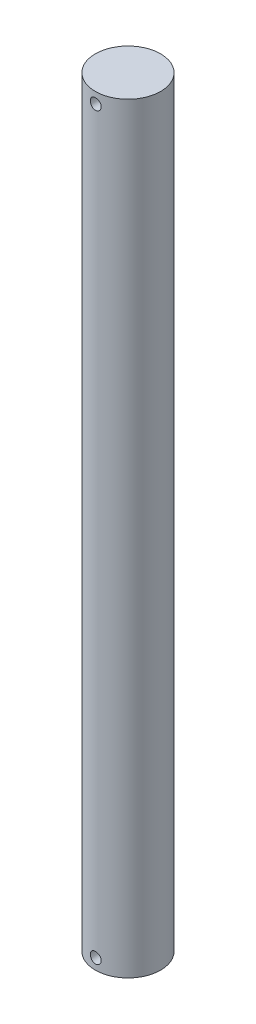
ISO-10303-21;
HEADER;
FILE_DESCRIPTION(('STEP AP214'),'2;1');
FILE_NAME('part.step','',(''),(''),'','','');
FILE_SCHEMA(('AUTOMOTIVE_DESIGN { 1 0 10303 214 1 1 1 1 }'));
ENDSEC;
DATA;
#1=APPLICATION_CONTEXT('core data for automotive mechanical design processes');
#2=APPLICATION_PROTOCOL_DEFINITION('international standard','automotive_design',2000,#1);
#3=PRODUCT_CONTEXT('',#1,'mechanical');
#4=PRODUCT('Part','Part','',(#3));
#5=PRODUCT_RELATED_PRODUCT_CATEGORY('part','',(#4));
#6=PRODUCT_DEFINITION_FORMATION('','',#4);
#7=PRODUCT_DEFINITION_CONTEXT('part definition',#1,'design');
#8=PRODUCT_DEFINITION('design','',#6,#7);
#9=PRODUCT_DEFINITION_SHAPE('','',#8);
#10=(LENGTH_UNIT() NAMED_UNIT(*) SI_UNIT(.MILLI.,.METRE.));
#11=(NAMED_UNIT(*) PLANE_ANGLE_UNIT() SI_UNIT($,.RADIAN.));
#12=(NAMED_UNIT(*) SI_UNIT($,.STERADIAN.) SOLID_ANGLE_UNIT());
#13=UNCERTAINTY_MEASURE_WITH_UNIT(LENGTH_MEASURE(1.E-05),#10,'distance_accuracy_value','');
#14=(GEOMETRIC_REPRESENTATION_CONTEXT(3) GLOBAL_UNCERTAINTY_ASSIGNED_CONTEXT((#13)) GLOBAL_UNIT_ASSIGNED_CONTEXT((#10,
#11,#12)) REPRESENTATION_CONTEXT('',''));
#15=CARTESIAN_POINT('',(0.,0.,0.));
#16=DIRECTION('',(0.,0.,1.));
#17=DIRECTION('',(1.,0.,0.));
#18=AXIS2_PLACEMENT_3D('',#15,#16,#17);
#19=CARTESIAN_POINT('',(0.,700.,0.));
#20=DIRECTION('',(0.,-1.,0.));
#21=DIRECTION('',(0.,0.,-1.));
#22=AXIS2_PLACEMENT_3D('',#19,#20,#21);
#23=CYLINDRICAL_SURFACE('',#22,30.);
#24=CARTESIAN_POINT('',(0.,15.,-30.));
#25=CARTESIAN_POINT('',(-0.139438730306518,15.000002148603,-30.0000009341092));
#26=CARTESIAN_POINT('',(-0.27884837499536,14.9941652443515,-29.9990260400444));
#27=CARTESIAN_POINT('',(-0.556708896140972,14.9708658164974,-29.9951557115238));
#28=CARTESIAN_POINT('',(-0.695159577308831,14.9534009913958,-29.9922598968632));
#29=CARTESIAN_POINT('',(-0.970150520344154,14.9069611871019,-29.9846251699259));
#30=CARTESIAN_POINT('',(-1.10668952072418,14.8779789470685,-29.979885095025));
#31=CARTESIAN_POINT('',(-1.37685247096437,14.8087139445941,-29.9686930297133));
#32=CARTESIAN_POINT('',(-1.51047533178691,14.7684270356836,-29.9622404112013));
#33=CARTESIAN_POINT('',(-1.77365528085701,14.6769149986391,-29.9478128865368));
#34=CARTESIAN_POINT('',(-1.90321704710935,14.6257030293222,-29.9398398129292));
#35=CARTESIAN_POINT('',(-2.15759207174616,14.512668231626,-29.9225843720656));
#36=CARTESIAN_POINT('',(-2.28240355940393,14.4508414928787,-29.9133015225275));
#37=CARTESIAN_POINT('',(-2.52631223217171,14.3170688876175,-29.8936901460056));
#38=CARTESIAN_POINT('',(-2.64541222152925,14.2451280566014,-29.8833621400859));
#39=CARTESIAN_POINT('',(-2.87720075943645,14.0915826775771,-29.8619368035706));
#40=CARTESIAN_POINT('',(-2.98988690101178,14.0099745365835,-29.8508391875783));
#41=CARTESIAN_POINT('',(-3.20893550320275,13.8369740483396,-29.8280901061561));
#42=CARTESIAN_POINT('',(-3.3152386019937,13.7455070296461,-29.8164348485225));
#43=CARTESIAN_POINT('',(-3.51981905081325,13.5539441062719,-29.792977049997));
#44=CARTESIAN_POINT('',(-3.6180934149484,13.4538450195095,-29.7811744561748));
#45=CARTESIAN_POINT('',(-3.80586900468401,13.2457655657288,-29.757760553176));
#46=CARTESIAN_POINT('',(-3.89537288715651,13.137787602886,-29.7461491869625));
#47=CARTESIAN_POINT('',(-4.06505128766863,12.9146207574097,-29.7234367117224));
#48=CARTESIAN_POINT('',(-4.14522235269035,12.7994292299429,-29.7123357924676));
#49=CARTESIAN_POINT('',(-4.29606801839333,12.5619714746938,-29.6909016370194));
#50=CARTESIAN_POINT('',(-4.36668480543058,12.4396680682227,-29.6805732300208));
#51=CARTESIAN_POINT('',(-4.49737903615683,12.1894109133508,-29.6610510502017));
#52=CARTESIAN_POINT('',(-4.55745254274493,12.0614550764348,-29.6518577016161));
#53=CARTESIAN_POINT('',(-4.66655756396113,11.800880688985,-29.6348831234285));
#54=CARTESIAN_POINT('',(-4.7155937427807,11.6682641354876,-29.6271012976113));
#55=CARTESIAN_POINT('',(-4.80229722760728,11.399267690265,-29.6131700678879));
#56=CARTESIAN_POINT('',(-4.83996038282925,11.2628864443209,-29.6070212600786));
#57=CARTESIAN_POINT('',(-4.93477467758659,10.8521985241443,-29.5914227981395));
#58=CARTESIAN_POINT('',(-4.97488357358493,10.5736311346302,-29.5846386003063));
#59=CARTESIAN_POINT('',(-5.00784793424048,10.0137968416156,-29.5790755483693));
#60=CARTESIAN_POINT('',(-5.00070674304215,9.73253013056755,-29.5802961277241));
#61=CARTESIAN_POINT('',(-4.93978637434362,9.17815552142718,-29.590529429811));
#62=CARTESIAN_POINT('',(-4.88648873937526,8.90499340626046,-29.5994616948564));
#63=CARTESIAN_POINT('',(-4.73550730524632,8.37155435088744,-29.6239896757343));
#64=CARTESIAN_POINT('',(-4.63782198375658,8.11127785294845,-29.6395856201047));
#65=CARTESIAN_POINT('',(-4.40035421574883,7.60954316628105,-29.6757696483376));
#66=CARTESIAN_POINT('',(-4.26037175365461,7.36818140582108,-29.6963813586744));
#67=CARTESIAN_POINT('',(-3.94242410922568,6.91219098092208,-29.7402583517709));
#68=CARTESIAN_POINT('',(-3.76445586128014,6.69756447634457,-29.7635238486315));
#69=CARTESIAN_POINT('',(-3.37296440409906,6.29834788785884,-29.8104405621052));
#70=CARTESIAN_POINT('',(-3.15902792232791,6.1141629788504,-29.8340929858411));
#71=CARTESIAN_POINT('',(-2.70307050338167,5.78424445873864,-29.8788520267263));
#72=CARTESIAN_POINT('',(-2.46104938526711,5.63851109538495,-29.8999586274719));
#73=CARTESIAN_POINT('',(-1.95541183087794,5.38959554997958,-29.9372778581815));
#74=CARTESIAN_POINT('',(-1.6917774507324,5.2864491623958,-29.9534863682324));
#75=CARTESIAN_POINT('',(-1.15059669160235,5.1260115684498,-29.9791500601698));
#76=CARTESIAN_POINT('',(-0.873051478491172,5.06871652607123,-29.988605806999));
#77=CARTESIAN_POINT('',(-0.315419802472563,5.00215728305926,-29.999622596864));
#78=CARTESIAN_POINT('',(-0.0354014741699759,4.99233685528185,-30.0012750602153));
#79=CARTESIAN_POINT('',(0.522279545647737,5.01952268996312,-29.9967494884638));
#80=CARTESIAN_POINT('',(0.799942327386603,5.05652715067645,-29.9905717546544));
#81=CARTESIAN_POINT('',(1.3433123514886,5.17584969428862,-29.971136538593));
#82=CARTESIAN_POINT('',(1.60908173821583,5.25789240039748,-29.9579220953842));
#83=CARTESIAN_POINT('',(2.12309376827574,5.46466905278275,-29.9258892897492));
#84=CARTESIAN_POINT('',(2.37133542643381,5.5894053964243,-29.9070706126377));
#85=CARTESIAN_POINT('',(2.84566138437114,5.87930218769945,-29.8656903236297));
#86=CARTESIAN_POINT('',(3.07153052223238,6.04481008114228,-29.8430971086773));
#87=CARTESIAN_POINT('',(3.49248715064582,6.41107486197913,-29.7967693569018));
#88=CARTESIAN_POINT('',(3.68757240338597,6.61183430971993,-29.7730347372687));
#89=CARTESIAN_POINT('',(4.04348563611056,7.04539422403469,-29.7268034705286));
#90=CARTESIAN_POINT('',(4.20393781021313,7.27850506055188,-29.7043221945332));
#91=CARTESIAN_POINT('',(4.48340433261341,7.76870920865032,-29.6634307237625));
#92=CARTESIAN_POINT('',(4.60241999444133,8.02580175968778,-29.6450203999454));
#93=CARTESIAN_POINT('',(4.79507773356379,8.55556730727753,-29.6144685973239));
#94=CARTESIAN_POINT('',(4.86890685306042,8.82817090119132,-29.602301310812));
#95=CARTESIAN_POINT('',(4.96966691993878,9.38228554337532,-29.5855561119601));
#96=CARTESIAN_POINT('',(4.99660194454599,9.66379581508378,-29.580977539818));
#97=CARTESIAN_POINT('',(5.0012321244509,10.0844097834175,-29.5801885462874));
#98=CARTESIAN_POINT('',(4.99693975789018,10.2235369220243,-29.5809172344068));
#99=CARTESIAN_POINT('',(4.97678436801742,10.5009125844857,-29.5843160283654));
#100=CARTESIAN_POINT('',(4.96092569221815,10.6391614187853,-29.5869854047428));
#101=CARTESIAN_POINT('',(4.91774640529922,10.9138477892768,-29.5941926651669));
#102=CARTESIAN_POINT('',(4.89042170080803,11.0502846606349,-29.5987312164982));
#103=CARTESIAN_POINT('',(4.82453301754958,11.3202964548754,-29.6095423170401));
#104=CARTESIAN_POINT('',(4.78597308458851,11.4538723894262,-29.615814242021));
#105=CARTESIAN_POINT('',(4.6979342864003,11.7171686051217,-29.6299071307843));
#106=CARTESIAN_POINT('',(4.64846435664851,11.846891943521,-29.6377268263817));
#107=CARTESIAN_POINT('',(4.53896986674982,12.1016587264378,-29.6546930297384));
#108=CARTESIAN_POINT('',(4.47894908739059,12.226703827951,-29.6638390620139));
#109=CARTESIAN_POINT('',(4.34874498523013,12.4713614507995,-29.6832065043881));
#110=CARTESIAN_POINT('',(4.27855767862003,12.5909718182554,-29.6934283356131));
#111=CARTESIAN_POINT('',(4.12855715704193,12.8238615256318,-29.7146554589665));
#112=CARTESIAN_POINT('',(4.04874732556529,12.9371430705211,-29.7256604751555));
#113=CARTESIAN_POINT('',(3.87899685367998,13.1580086987021,-29.7482907408856));
#114=CARTESIAN_POINT('',(3.78894418512202,13.2655060901041,-29.7599219326499));
#115=CARTESIAN_POINT('',(3.60017574898997,13.472513396479,-29.783347263822));
#116=CARTESIAN_POINT('',(3.50146308651917,13.5720261500963,-29.7951413435574));
#117=CARTESIAN_POINT('',(3.29596225179814,13.7624819299774,-29.8185735949796));
#118=CARTESIAN_POINT('',(3.18916929766622,13.8534198090311,-29.8302116694714));
#119=CARTESIAN_POINT('',(2.9683310868055,14.0259957161049,-29.8529952569281));
#120=CARTESIAN_POINT('',(2.85428852146921,14.1076371643346,-29.8641409501131));
#121=CARTESIAN_POINT('',(2.6188382428721,14.2616450304106,-29.8857116363867));
#122=CARTESIAN_POINT('',(2.49738284629917,14.3339393989323,-29.896130775176));
#123=CARTESIAN_POINT('',(2.24876507402075,14.4679967471859,-29.9158586577262));
#124=CARTESIAN_POINT('',(2.12160481976541,14.5297636014166,-29.925167809621));
#125=CARTESIAN_POINT('',(1.86251821435405,14.6423007062681,-29.9424090895346));
#126=CARTESIAN_POINT('',(1.7305952461548,14.6930785897747,-29.950342172599));
#127=CARTESIAN_POINT('',(1.46288984328885,14.7832948188954,-29.9646113279921));
#128=CARTESIAN_POINT('',(1.32710824358209,14.8227355974939,-29.9709477429356));
#129=CARTESIAN_POINT('',(0.99549214137986,14.9039783011701,-29.9841083147641));
#130=CARTESIAN_POINT('',(0.798161887183512,14.9399436570318,-29.9900398634941));
#131=CARTESIAN_POINT('',(0.400534394814459,14.9879527577987,-29.9979850016837));
#132=CARTESIAN_POINT('',(0.20023720778345,14.9999969145569,-29.9999986585978));
#133=CARTESIAN_POINT('',(0.,15.,-30.));
#134=B_SPLINE_CURVE_WITH_KNOTS('',3,(#24,#25,#26,#27,#28,#29,#30,#31,#32,#33,#34,#35,#36,#37,
#38,#39,#40,#41,#42,#43,#44,#45,#46,#47,#48,#49,#50,#51,#52,#53,#54,#55,#56,#57,#58,#59,#60,#61,
#62,#63,#64,#65,#66,#67,#68,#69,#70,#71,#72,#73,#74,#75,#76,#77,#78,#79,#80,#81,#82,#83,#84,#85,
#86,#87,#88,#89,#90,#91,#92,#93,#94,#95,#96,#97,#98,#99,#100,#101,#102,#103,#104,#105,#106,#107,
#108,#109,#110,#111,#112,#113,#114,#115,#116,#117,#118,#119,#120,#121,#122,#123,#124,#125,#126,
#127,#128,#129,#130,#131,#132,#133),.UNSPECIFIED.,.T.,.F.,(4,2,2,2,2,2,2,2,2,2,2,2,2,2,2,2,2,2,
2,2,2,2,2,2,2,2,2,2,2,2,2,2,2,2,2,2,2,2,2,2,2,2,2,2,2,2,2,2,2,2,2,2,2,2,4),(0.,
0.418140677636318,0.836364141924731,1.25485168316257,1.67349292366114,2.09163274536574,
2.50992693714591,2.92801360569262,3.3462561521736,3.767924736377,4.18974943231197,
4.61144594582073,5.03329798883921,5.45759827861687,5.88205667621393,6.30633536657102,
6.73076871826474,7.57090272280959,8.41097726715885,9.24239161594929,10.0738344812487,
10.9092723133923,11.7447775943526,12.5906365789677,13.4365010134581,14.2830749590592,
15.1295780711641,15.9661388505691,16.8026674414583,17.6341373208694,18.4656538972625,
19.3045176932816,20.1434424418268,20.9910576208935,21.83864592826,22.6827016275766,
23.5266839364735,23.9438629667131,24.3608852695982,24.77805657625,25.1950778447662,
25.6117588257789,26.0282907967259,26.4449864317718,26.8615359724481,27.2831832626947,
27.7046799813852,28.1264281209232,28.5480205921467,28.9726903230862,29.3972034214198,
29.8214207018257,30.2455468755532,30.8460167962321,31.4464763784911),.UNSPECIFIED.);
#135=CARTESIAN_POINT('',(0.,15.,-30.));
#136=VERTEX_POINT('',#135);
#137=EDGE_CURVE('E10',#136,#136,#134,.T.);
#138=ORIENTED_EDGE('',*,*,#137,.T.);
#139=EDGE_LOOP('',(#138));
#140=FACE_BOUND('',#139,.T.);
#141=CARTESIAN_POINT('',(5.,9.99999999999999,29.5803989154981));
#142=CARTESIAN_POINT('',(5.00000215212787,9.86057639626243,29.5803979326159));
#143=CARTESIAN_POINT('',(4.99416650120511,9.72118188035827,29.5813865662228));
#144=CARTESIAN_POINT('',(4.97087220441201,9.44335202662435,29.5853101778166));
#145=CARTESIAN_POINT('',(4.95341125568433,9.30491688432795,29.5882455414312));
#146=CARTESIAN_POINT('',(4.90698205316678,9.02995735248328,29.595980767529));
#147=CARTESIAN_POINT('',(4.87800651661557,8.89343422893418,29.6007818099767));
#148=CARTESIAN_POINT('',(4.80875805511328,8.62330337377943,29.6121103008977));
#149=CARTESIAN_POINT('',(4.76848098179349,8.48969673215014,29.618638383252));
#150=CARTESIAN_POINT('',(4.67699269476572,8.22655128993244,29.6332225751521));
#151=CARTESIAN_POINT('',(4.62579483693731,8.09700774026884,29.6412768169069));
#152=CARTESIAN_POINT('',(4.51279168660919,7.8426675985294,29.6586914491271));
#153=CARTESIAN_POINT('',(4.45098248431024,7.71787277692327,29.6680523207879));
#154=CARTESIAN_POINT('',(4.3172476442902,7.47399448609597,29.6878078821124));
#155=CARTESIAN_POINT('',(4.24532702372849,7.35490822341934,29.6982020583187));
#156=CARTESIAN_POINT('',(4.09182393832117,7.1231434031446,29.7197406344104));
#157=CARTESIAN_POINT('',(4.01023788081428,7.01046725137721,29.7308853125904));
#158=CARTESIAN_POINT('',(3.83725956163011,6.79140518707714,29.7537075193766));
#159=CARTESIAN_POINT('',(3.74579019488665,6.68508053864487,29.765388757594));
#160=CARTESIAN_POINT('',(3.55421801378063,6.48045677901976,29.7888712088753));
#161=CARTESIAN_POINT('',(3.45411201537784,6.38216065390049,29.8006724647591));
#162=CARTESIAN_POINT('',(3.2460144077782,6.19434246688342,29.8240565154478));
#163=CARTESIAN_POINT('',(3.13802523187875,6.1048177173451,29.8356393762872));
#164=CARTESIAN_POINT('',(2.91483167477465,5.9350991630834,29.8582708932577));
#165=CARTESIAN_POINT('',(2.79962464827634,5.85490881049046,29.8693193508737));
#166=CARTESIAN_POINT('',(2.56215441101307,5.7040411409087,29.8906281533999));
#167=CARTESIAN_POINT('',(2.43985519869266,5.6334197920083,29.9008837226048));
#168=CARTESIAN_POINT('',(2.18960603977585,5.50271600286675,29.9202504077895));
#169=CARTESIAN_POINT('',(2.06165400465136,5.44263749931004,29.9293610959132));
#170=CARTESIAN_POINT('',(1.80108735309577,5.33352223665116,29.9461700436224));
#171=CARTESIAN_POINT('',(1.6684747236184,5.28448083656165,29.9538688966168));
#172=CARTESIAN_POINT('',(1.39948700260422,5.19776675687594,29.9676431912186));
#173=CARTESIAN_POINT('',(1.26311055653696,5.16009822997123,29.9737180397443));
#174=CARTESIAN_POINT('',(0.852446509264918,5.0652690310551,29.9891228124451));
#175=CARTESIAN_POINT('',(0.573900376996178,5.02514865906307,29.9958138795881));
#176=CARTESIAN_POINT('',(0.0141079703099225,4.99215400160735,30.0013047692693));
#177=CARTESIAN_POINT('',(-0.267138119279395,4.99927650479383,30.000105128181));
#178=CARTESIAN_POINT('',(-0.821593120474354,5.06016652948971,29.9900163282399));
#179=CARTESIAN_POINT('',(-1.09485404654849,5.11347135228088,29.9812034486287));
#180=CARTESIAN_POINT('',(-1.6284869741672,5.26450112299916,29.9569598006588));
#181=CARTESIAN_POINT('',(-1.88885858289245,5.36222742380764,29.9415288307432));
#182=CARTESIAN_POINT('',(-2.39071148226925,5.59978155726274,29.9056539094833));
#183=CARTESIAN_POINT('',(-2.63210082802069,5.73980009832084,29.885187330251));
#184=CARTESIAN_POINT('',(-3.08813127772834,6.05782557110812,29.8415147777179));
#185=CARTESIAN_POINT('',(-3.30277021457954,6.23583557743863,29.8183085827714));
#186=CARTESIAN_POINT('',(-3.70194248743282,6.62735763346403,29.77140536021));
#187=CARTESIAN_POINT('',(-3.88607898857917,6.84127419522207,29.7477057934308));
#188=CARTESIAN_POINT('',(-4.21590919282353,7.29717417501147,29.7027591968862));
#189=CARTESIAN_POINT('',(-4.36160254131311,7.5391578519107,29.6815121897447));
#190=CARTESIAN_POINT('',(-4.61048886472354,8.04478328521151,29.6438750909177));
#191=CARTESIAN_POINT('',(-4.71363405349992,8.30844899658137,29.6274904659697));
#192=CARTESIAN_POINT('',(-4.87405974268971,8.84969814421793,29.6015237738799));
#193=CARTESIAN_POINT('',(-4.93134428151734,9.12728035273259,29.5919411077771));
#194=CARTESIAN_POINT('',(-4.99786376977689,9.68493231245493,29.5807791884317));
#195=CARTESIAN_POINT('',(-5.0076644169312,9.96493275953604,29.5791057152116));
#196=CARTESIAN_POINT('',(-4.98044540425865,10.5225733432498,29.583700695609));
#197=CARTESIAN_POINT('',(-4.94342755284268,10.8002135706313,29.5899688424735));
#198=CARTESIAN_POINT('',(-4.82410467423498,11.3434555187759,29.6096537492629));
#199=CARTESIAN_POINT('',(-4.74208759766018,11.6091222811975,29.6230250389774));
#200=CARTESIAN_POINT('',(-4.53539636401618,12.1229403311174,29.6553714594995));
#201=CARTESIAN_POINT('',(-4.4107196551057,12.3710905697294,29.6743469255321));
#202=CARTESIAN_POINT('',(-4.12091340811815,12.8453491942341,29.7159825702484));
#203=CARTESIAN_POINT('',(-3.95542135942323,13.0712331658314,29.7386751206295));
#204=CARTESIAN_POINT('',(-3.5891787002952,13.4922270450693,29.7850933249741));
#205=CARTESIAN_POINT('',(-3.38842560992089,13.6873347863563,29.8088190515135));
#206=CARTESIAN_POINT('',(-2.95485701247824,14.0433038621095,29.8549284748932));
#207=CARTESIAN_POINT('',(-2.72172977623535,14.2037879400263,29.8772956488783));
#208=CARTESIAN_POINT('',(-2.23148362654147,14.4833103665618,29.9179021266779));
#209=CARTESIAN_POINT('',(-1.97436548948827,14.6023500558218,29.9361415640095));
#210=CARTESIAN_POINT('',(-1.44461025477472,14.7950222363159,29.9663676167788));
#211=CARTESIAN_POINT('',(-1.17204638474136,14.8688521307716,29.9783813800026));
#212=CARTESIAN_POINT('',(-0.618016213936816,14.9696272189533,29.9949099748744));
#213=CARTESIAN_POINT('',(-0.336550647617407,14.9965762704526,29.999425423549));
#214=CARTESIAN_POINT('',(0.084051323623507,15.001239001663,30.0002084581204));
#215=CARTESIAN_POINT('',(0.223209655690205,14.9969552500374,29.999491569583));
#216=CARTESIAN_POINT('',(0.500648669793316,14.9768117991662,29.9961418479859));
#217=CARTESIAN_POINT('',(0.638929661828227,14.9609564482256,29.9935097346187));
#218=CARTESIAN_POINT('',(0.913680965571359,14.9177783012345,29.9863985702464));
#219=CARTESIAN_POINT('',(1.05015061623528,14.8904514312823,29.9819188631118));
#220=CARTESIAN_POINT('',(1.32022824391753,14.824552637904,29.9712403869649));
#221=CARTESIAN_POINT('',(1.45383723354143,14.7859847666036,29.9650422374513));
#222=CARTESIAN_POINT('',(1.71720548972901,14.6979220262972,29.95110323313));
#223=CARTESIAN_POINT('',(1.84696762706274,14.6484355508395,29.9433635637899));
#224=CARTESIAN_POINT('',(2.10180951631926,14.5389013361162,29.9265550855046));
#225=CARTESIAN_POINT('',(2.22689092747563,14.4788573831337,29.9174867532583));
#226=CARTESIAN_POINT('',(2.47161697545382,14.3486011123381,29.8982638774694));
#227=CARTESIAN_POINT('',(2.59125946645759,14.2783848261974,29.8881089104256));
#228=CARTESIAN_POINT('',(2.8242079991635,14.1283215520988,29.8669972490416));
#229=CARTESIAN_POINT('',(2.93751624967617,14.048477952327,29.8560408372885));
#230=CARTESIAN_POINT('',(3.15838432816091,13.8786904463363,29.8334892153085));
#231=CARTESIAN_POINT('',(3.26586029407928,13.788638226688,29.8218879813952));
#232=CARTESIAN_POINT('',(3.47282432265109,13.5998751311197,29.7984955265668));
#233=CARTESIAN_POINT('',(3.57231522401815,13.5011673586216,29.7867043749739));
#234=CARTESIAN_POINT('',(3.76272784850023,13.2956806705058,29.7632506471209));
#235=CARTESIAN_POINT('',(3.85364439911056,13.1888969521477,29.7515881521716));
#236=CARTESIAN_POINT('',(4.02617893630593,12.9680815442526,29.7287311492829));
#237=CARTESIAN_POINT('',(4.10780033921658,12.8540525418,29.7175364703668));
#238=CARTESIAN_POINT('',(4.26178317336446,12.6186134362886,29.6958464681928));
#239=CARTESIAN_POINT('',(4.33407091155741,12.4971545774759,29.6853569910252));
#240=CARTESIAN_POINT('',(4.4681147095236,12.2485306516489,29.6654772768531));
#241=CARTESIAN_POINT('',(4.5298746441277,12.1213677059251,29.6560866358151));
#242=CARTESIAN_POINT('',(4.6423978626488,11.8622759875397,29.6386805621146));
#243=CARTESIAN_POINT('',(4.69316880713277,11.7303506101737,29.6306641722598));
#244=CARTESIAN_POINT('',(4.7833713057041,11.4626397573099,29.6162360630624));
#245=CARTESIAN_POINT('',(4.82280529766023,11.326855118609,29.6098239987682));
#246=CARTESIAN_POINT('',(4.90401989375999,10.9952779254209,29.596502515164));
#247=CARTESIAN_POINT('',(4.93996956730933,10.7979905965017,29.5904931161671));
#248=CARTESIAN_POINT('',(4.98795785830044,10.4004488187018,29.5824420579954));
#249=CARTESIAN_POINT('',(4.99999690982024,10.2001944237523,29.5804003267909));
#250=CARTESIAN_POINT('',(5.,9.99999999999999,29.5803989154981));
#251=B_SPLINE_CURVE_WITH_KNOTS('',3,(#141,#142,#143,#144,#145,#146,#147,#148,#149,#150,#151,
#152,#153,#154,#155,#156,#157,#158,#159,#160,#161,#162,#163,#164,#165,#166,#167,#168,#169,#170,
#171,#172,#173,#174,#175,#176,#177,#178,#179,#180,#181,#182,#183,#184,#185,#186,#187,#188,#189,
#190,#191,#192,#193,#194,#195,#196,#197,#198,#199,#200,#201,#202,#203,#204,#205,#206,#207,#208,
#209,#210,#211,#212,#213,#214,#215,#216,#217,#218,#219,#220,#221,#222,#223,#224,#225,#226,#227,
#228,#229,#230,#231,#232,#233,#234,#235,#236,#237,#238,#239,#240,#241,#242,#243,#244,#245,#246,
#247,#248,#249,#250),.UNSPECIFIED.,.T.,.F.,(4,2,2,2,2,2,2,2,2,2,2,2,2,2,2,2,2,2,2,2,2,2,2,2,2,2,
2,2,2,2,2,2,2,2,2,2,2,2,2,2,2,2,2,2,2,2,2,2,2,2,2,2,2,2,4),(0.,0.418095242549752,
0.836273330312913,1.25471632992755,1.67331312559436,2.09140089204124,2.50964303678586,
2.92767838265871,3.34586960348905,3.76759791918756,4.18948238202711,4.61123716813954,
5.03314743913425,5.45742771408346,5.88186607917447,6.30612563749769,6.730539923145,
7.57061257037404,8.41062811397658,9.24232364421611,10.0740445059134,10.9095733037112,
11.745169745458,12.5909036901652,13.4366454358431,14.2833344708948,15.1299489396843,
15.966452069331,16.8029228892023,17.6341025136326,18.4653318667942,19.3042280761768,
20.1431833095365,20.9908634816304,21.8385162304567,22.6824409092757,23.5262961391698,
23.9435677338949,24.3606826095272,24.7779457414127,25.1950586450546,25.6118520083923,
26.0284961987167,26.4453033659293,26.8619642700311,27.2835543146456,27.7049938127195,
28.1266859407461,28.5482225769884,28.9729067446496,29.3974342652835,29.8216648822648,
30.2458042054463,30.8461462814325,31.4464774585936),.UNSPECIFIED.);
#252=CARTESIAN_POINT('',(5.,9.99999999999999,29.5803989154981));
#253=VERTEX_POINT('',#252);
#254=EDGE_CURVE('E44',#253,#253,#251,.T.);
#255=ORIENTED_EDGE('',*,*,#254,.T.);
#256=EDGE_LOOP('',(#255));
#257=FACE_BOUND('',#256,.T.);
#258=CARTESIAN_POINT('',(0.,695.,-30.));
#259=CARTESIAN_POINT('',(-0.139438730306518,695.000002148603,-30.0000009341092));
#260=CARTESIAN_POINT('',(-0.27884837499536,694.994165244351,-29.9990260400444));
#261=CARTESIAN_POINT('',(-0.556708896140978,694.970865816498,-29.9951557115238));
#262=CARTESIAN_POINT('',(-0.695159577308843,694.953400991396,-29.9922598968632));
#263=CARTESIAN_POINT('',(-0.970150520344159,694.906961187102,-29.9846251699259));
#264=CARTESIAN_POINT('',(-1.10668952072417,694.877978947068,-29.979885095025));
#265=CARTESIAN_POINT('',(-1.37685247096437,694.808713944594,-29.9686930297133));
#266=CARTESIAN_POINT('',(-1.51047533178691,694.768427035684,-29.9622404112013));
#267=CARTESIAN_POINT('',(-1.77365528085701,694.676914998639,-29.9478128865369));
#268=CARTESIAN_POINT('',(-1.90321704710933,694.625703029322,-29.9398398129292));
#269=CARTESIAN_POINT('',(-2.15759207174611,694.512668231626,-29.9225843720657));
#270=CARTESIAN_POINT('',(-2.28240355940388,694.450841492879,-29.9133015225275));
#271=CARTESIAN_POINT('',(-2.52631223217166,694.317068887617,-29.8936901460056));
#272=CARTESIAN_POINT('',(-2.6454122215292,694.245128056601,-29.8833621400859));
#273=CARTESIAN_POINT('',(-2.8772007594364,694.091582677577,-29.8619368035706));
#274=CARTESIAN_POINT('',(-2.98988690101173,694.009974536583,-29.8508391875783));
#275=CARTESIAN_POINT('',(-3.20893550320272,693.83697404834,-29.8280901061561));
#276=CARTESIAN_POINT('',(-3.3152386019937,693.745507029646,-29.8164348485225));
#277=CARTESIAN_POINT('',(-3.51981905081324,693.553944106272,-29.792977049997));
#278=CARTESIAN_POINT('',(-3.61809341494837,693.453845019509,-29.7811744561748));
#279=CARTESIAN_POINT('',(-3.80586900468396,693.245765565729,-29.757760553176));
#280=CARTESIAN_POINT('',(-3.89537288715646,693.137787602886,-29.7461491869625));
#281=CARTESIAN_POINT('',(-4.06505128766861,692.91462075741,-29.7234367117224));
#282=CARTESIAN_POINT('',(-4.14522235269035,692.799429229943,-29.7123357924676));
#283=CARTESIAN_POINT('',(-4.29606801839333,692.561971474694,-29.6909016370194));
#284=CARTESIAN_POINT('',(-4.36668480543057,692.439668068223,-29.6805732300208));
#285=CARTESIAN_POINT('',(-4.49737903615682,692.189410913351,-29.6610510502017));
#286=CARTESIAN_POINT('',(-4.55745254274493,692.061455076435,-29.6518577016161));
#287=CARTESIAN_POINT('',(-4.66655756396112,691.800880688985,-29.6348831234285));
#288=CARTESIAN_POINT('',(-4.71559374278068,691.668264135488,-29.6271012976113));
#289=CARTESIAN_POINT('',(-4.80229722760726,691.399267690265,-29.6131700678879));
#290=CARTESIAN_POINT('',(-4.83996038282923,691.262886444321,-29.6070212600786));
#291=CARTESIAN_POINT('',(-4.93477467758658,690.852198524144,-29.5914227981395));
#292=CARTESIAN_POINT('',(-4.97488357358494,690.57363113463,-29.5846386003063));
#293=CARTESIAN_POINT('',(-5.00784793424048,690.013796841616,-29.5790755483693));
#294=CARTESIAN_POINT('',(-5.00070674304215,689.732530130568,-29.5802961277241));
#295=CARTESIAN_POINT('',(-4.93978637434363,689.178155521427,-29.590529429811));
#296=CARTESIAN_POINT('',(-4.88648873937526,688.90499340626,-29.5994616948564));
#297=CARTESIAN_POINT('',(-4.73550730524632,688.371554350887,-29.6239896757343));
#298=CARTESIAN_POINT('',(-4.63782198375657,688.111277852948,-29.6395856201047));
#299=CARTESIAN_POINT('',(-4.40035421574883,687.609543166281,-29.6757696483376));
#300=CARTESIAN_POINT('',(-4.26037175365462,687.368181405821,-29.6963813586744));
#301=CARTESIAN_POINT('',(-3.94242410922568,686.912190980922,-29.7402583517709));
#302=CARTESIAN_POINT('',(-3.76445586128012,686.697564476344,-29.7635238486315));
#303=CARTESIAN_POINT('',(-3.37296440409904,686.298347887859,-29.8104405621052));
#304=CARTESIAN_POINT('',(-3.1590279223279,686.11416297885,-29.8340929858412));
#305=CARTESIAN_POINT('',(-2.70307050338167,685.784244458738,-29.8788520267263));
#306=CARTESIAN_POINT('',(-2.46104938526713,685.638511095385,-29.8999586274719));
#307=CARTESIAN_POINT('',(-1.95541183087796,685.38959554998,-29.9372778581815));
#308=CARTESIAN_POINT('',(-1.69177745073242,685.286449162396,-29.9534863682324));
#309=CARTESIAN_POINT('',(-1.15059669160236,685.12601156845,-29.9791500601698));
#310=CARTESIAN_POINT('',(-0.873051478491191,685.068716526071,-29.988605806999));
#311=CARTESIAN_POINT('',(-0.315419802472583,685.002157283059,-29.999622596864));
#312=CARTESIAN_POINT('',(-0.0354014741699932,684.992336855282,-30.0012750602153));
#313=CARTESIAN_POINT('',(0.52227954564772,685.019522689963,-29.9967494884638));
#314=CARTESIAN_POINT('',(0.799942327386584,685.056527150676,-29.9905717546544));
#315=CARTESIAN_POINT('',(1.34331235148858,685.175849694289,-29.971136538593));
#316=CARTESIAN_POINT('',(1.6090817382158,685.257892400398,-29.9579220953842));
#317=CARTESIAN_POINT('',(2.12309376827572,685.464669052783,-29.9258892897492));
#318=CARTESIAN_POINT('',(2.37133542643378,685.589405396424,-29.9070706126377));
#319=CARTESIAN_POINT('',(2.84566138437115,685.879302187699,-29.8656903236297));
#320=CARTESIAN_POINT('',(3.07153052223244,686.044810081142,-29.8430971086773));
#321=CARTESIAN_POINT('',(3.49248715064588,686.411074861979,-29.7967693569018));
#322=CARTESIAN_POINT('',(3.68757240338601,686.61183430972,-29.7730347372687));
#323=CARTESIAN_POINT('',(4.04348563611058,687.045394224035,-29.7268034705286));
#324=CARTESIAN_POINT('',(4.20393781021316,687.278505060552,-29.7043221945332));
#325=CARTESIAN_POINT('',(4.48340433261343,687.76870920865,-29.6634307237625));
#326=CARTESIAN_POINT('',(4.60241999444136,688.025801759688,-29.6450203999454));
#327=CARTESIAN_POINT('',(4.79507773356381,688.555567307278,-29.6144685973239));
#328=CARTESIAN_POINT('',(4.86890685306044,688.828170901191,-29.602301310812));
#329=CARTESIAN_POINT('',(4.96966691993878,689.382285543375,-29.5855561119601));
#330=CARTESIAN_POINT('',(4.99660194454599,689.663795815084,-29.580977539818));
#331=CARTESIAN_POINT('',(5.00123212445091,690.084409783417,-29.5801885462874));
#332=CARTESIAN_POINT('',(4.99693975789018,690.223536922024,-29.5809172344068));
#333=CARTESIAN_POINT('',(4.97678436801742,690.500912584486,-29.5843160283654));
#334=CARTESIAN_POINT('',(4.96092569221813,690.639161418785,-29.5869854047428));
#335=CARTESIAN_POINT('',(4.91774640529919,690.913847789277,-29.5941926651669));
#336=CARTESIAN_POINT('',(4.89042170080801,691.050284660635,-29.5987312164982));
#337=CARTESIAN_POINT('',(4.82453301754958,691.320296454875,-29.6095423170401));
#338=CARTESIAN_POINT('',(4.78597308458851,691.453872389426,-29.615814242021));
#339=CARTESIAN_POINT('',(4.69793428640032,691.717168605122,-29.6299071307843));
#340=CARTESIAN_POINT('',(4.64846435664854,691.846891943521,-29.6377268263816));
#341=CARTESIAN_POINT('',(4.53896986674986,692.101658726438,-29.6546930297384));
#342=CARTESIAN_POINT('',(4.47894908739064,692.226703827951,-29.6638390620139));
#343=CARTESIAN_POINT('',(4.34874498523016,692.471361450799,-29.6832065043881));
#344=CARTESIAN_POINT('',(4.27855767862005,692.590971818255,-29.6934283356131));
#345=CARTESIAN_POINT('',(4.12855715704195,692.823861525632,-29.7146554589665));
#346=CARTESIAN_POINT('',(4.04874732556532,692.937143070521,-29.7256604751555));
#347=CARTESIAN_POINT('',(3.87899685368003,693.158008698702,-29.7482907408856));
#348=CARTESIAN_POINT('',(3.7889441851221,693.265506090104,-29.7599219326499));
#349=CARTESIAN_POINT('',(3.60017574899004,693.472513396479,-29.783347263822));
#350=CARTESIAN_POINT('',(3.50146308651922,693.572026150096,-29.7951413435574));
#351=CARTESIAN_POINT('',(3.29596225179818,693.762481929977,-29.8185735949796));
#352=CARTESIAN_POINT('',(3.18916929766628,693.853419809031,-29.8302116694714));
#353=CARTESIAN_POINT('',(2.96833108680555,694.025995716105,-29.8529952569281));
#354=CARTESIAN_POINT('',(2.85428852146923,694.107637164334,-29.8641409501131));
#355=CARTESIAN_POINT('',(2.61883824287211,694.26164503041,-29.8857116363867));
#356=CARTESIAN_POINT('',(2.4973828462992,694.333939398932,-29.896130775176));
#357=CARTESIAN_POINT('',(2.24876507402079,694.467996747186,-29.9158586577262));
#358=CARTESIAN_POINT('',(2.12160481976543,694.529763601416,-29.925167809621));
#359=CARTESIAN_POINT('',(1.86251821435406,694.642300706268,-29.9424090895346));
#360=CARTESIAN_POINT('',(1.73059524615483,694.693078589775,-29.950342172599));
#361=CARTESIAN_POINT('',(1.46288984328888,694.783294818895,-29.9646113279921));
#362=CARTESIAN_POINT('',(1.32710824358211,694.822735597494,-29.9709477429356));
#363=CARTESIAN_POINT('',(0.995492141379863,694.90397830117,-29.9841083147641));
#364=CARTESIAN_POINT('',(0.79816188718352,694.939943657032,-29.9900398634941));
#365=CARTESIAN_POINT('',(0.400534394814466,694.987952757799,-29.9979850016837));
#366=CARTESIAN_POINT('',(0.200237207783452,694.999996914557,-29.9999986585978));
#367=CARTESIAN_POINT('',(0.,695.,-30.));
#368=B_SPLINE_CURVE_WITH_KNOTS('',3,(#258,#259,#260,#261,#262,#263,#264,#265,#266,#267,#268,
#269,#270,#271,#272,#273,#274,#275,#276,#277,#278,#279,#280,#281,#282,#283,#284,#285,#286,#287,
#288,#289,#290,#291,#292,#293,#294,#295,#296,#297,#298,#299,#300,#301,#302,#303,#304,#305,#306,
#307,#308,#309,#310,#311,#312,#313,#314,#315,#316,#317,#318,#319,#320,#321,#322,#323,#324,#325,
#326,#327,#328,#329,#330,#331,#332,#333,#334,#335,#336,#337,#338,#339,#340,#341,#342,#343,#344,
#345,#346,#347,#348,#349,#350,#351,#352,#353,#354,#355,#356,#357,#358,#359,#360,#361,#362,#363,
#364,#365,#366,#367),.UNSPECIFIED.,.T.,.F.,(4,2,2,2,2,2,2,2,2,2,2,2,2,2,2,2,2,2,2,2,2,2,2,2,2,2,
2,2,2,2,2,2,2,2,2,2,2,2,2,2,2,2,2,2,2,2,2,2,2,2,2,2,2,2,4),(0.,0.41814067763632,
0.836364141924734,1.25485168316258,1.67349292366113,2.0916327453657,2.50992693714586,
2.92801360569253,3.34625615217359,3.76792473637702,4.1897494323119,4.61144594582066,
5.03329798883919,5.45759827861691,5.88205667621394,6.30633536657084,6.73076871826466,
7.57090272280964,8.41097726715884,9.24239161594934,10.0738344812487,10.9092723133923,
11.7447775943526,12.5906365789677,13.4365010134581,14.2830749590592,15.1295780711641,
15.9661388505691,16.8026674414583,17.6341373208694,18.4656538972624,19.3045176932817,
20.1434424418268,20.9910576208937,21.83864592826,22.6827016275766,23.5266839364735,
23.9438629667132,24.3608852695984,24.77805657625,25.1950778447662,25.6117588257789,
26.0282907967258,26.4449864317718,26.8615359724481,27.2831832626946,27.7046799813851,
28.1264281209232,28.5480205921467,28.9726903230862,29.3972034214197,29.8214207018257,
30.2455468755532,30.8460167962321,31.4464763784911),.UNSPECIFIED.);
#369=CARTESIAN_POINT('',(0.,695.,-30.));
#370=VERTEX_POINT('',#369);
#371=EDGE_CURVE('E48',#370,#370,#368,.T.);
#372=ORIENTED_EDGE('',*,*,#371,.T.);
#373=EDGE_LOOP('',(#372));
#374=FACE_BOUND('',#373,.T.);
#375=CARTESIAN_POINT('',(5.00000000000001,690.,29.5803989154981));
#376=CARTESIAN_POINT('',(5.00000215212788,689.860576396262,29.5803979326159));
#377=CARTESIAN_POINT('',(4.99416650120511,689.721181880358,29.5813865662228));
#378=CARTESIAN_POINT('',(4.97087220441201,689.443352026624,29.5853101778166));
#379=CARTESIAN_POINT('',(4.95341125568432,689.304916884328,29.5882455414312));
#380=CARTESIAN_POINT('',(4.90698205316676,689.029957352483,29.595980767529));
#381=CARTESIAN_POINT('',(4.87800651661556,688.893434228934,29.6007818099767));
#382=CARTESIAN_POINT('',(4.80875805511327,688.623303373779,29.6121103008977));
#383=CARTESIAN_POINT('',(4.76848098179349,688.48969673215,29.618638383252));
#384=CARTESIAN_POINT('',(4.67699269476573,688.226551289932,29.6332225751521));
#385=CARTESIAN_POINT('',(4.62579483693733,688.097007740269,29.6412768169069));
#386=CARTESIAN_POINT('',(4.5127916866092,687.842667598529,29.6586914491271));
#387=CARTESIAN_POINT('',(4.45098248431025,687.717872776923,29.6680523207879));
#388=CARTESIAN_POINT('',(4.3172476442902,687.473994486096,29.6878078821124));
#389=CARTESIAN_POINT('',(4.24532702372849,687.354908223419,29.6982020583187));
#390=CARTESIAN_POINT('',(4.09182393832119,687.123143403145,29.7197406344104));
#391=CARTESIAN_POINT('',(4.0102378808143,687.010467251377,29.7308853125904));
#392=CARTESIAN_POINT('',(3.83725956163015,686.791405187077,29.7537075193766));
#393=CARTESIAN_POINT('',(3.7457901948867,686.685080538645,29.765388757594));
#394=CARTESIAN_POINT('',(3.55421801378068,686.48045677902,29.7888712088753));
#395=CARTESIAN_POINT('',(3.45411201537788,686.382160653901,29.8006724647591));
#396=CARTESIAN_POINT('',(3.24601440777824,686.194342466884,29.8240565154478));
#397=CARTESIAN_POINT('',(3.13802523187879,686.104817717345,29.8356393762872));
#398=CARTESIAN_POINT('',(2.91483167477469,685.935099163083,29.8582708932577));
#399=CARTESIAN_POINT('',(2.79962464827637,685.854908810491,29.8693193508737));
#400=CARTESIAN_POINT('',(2.5621544110131,685.704041140909,29.8906281533999));
#401=CARTESIAN_POINT('',(2.43985519869271,685.633419792008,29.9008837226048));
#402=CARTESIAN_POINT('',(2.1896060397759,685.502716002867,29.9202504077895));
#403=CARTESIAN_POINT('',(2.06165400465139,685.44263749931,29.9293610959132));
#404=CARTESIAN_POINT('',(1.80108735309578,685.333522236651,29.9461700436224));
#405=CARTESIAN_POINT('',(1.66847472361842,685.284480836562,29.9538688966168));
#406=CARTESIAN_POINT('',(1.39948700260425,685.197766756876,29.9676431912185));
#407=CARTESIAN_POINT('',(1.26311055653701,685.160098229971,29.9737180397443));
#408=CARTESIAN_POINT('',(0.852446509264985,685.065269031055,29.9891228124451));
#409=CARTESIAN_POINT('',(0.573900376996245,685.025148659063,29.9958138795881));
#410=CARTESIAN_POINT('',(0.0141079703099888,684.992154001607,30.0013047692693));
#411=CARTESIAN_POINT('',(-0.26713811927933,684.999276504794,30.000105128181));
#412=CARTESIAN_POINT('',(-0.821593120474298,685.06016652949,29.9900163282399));
#413=CARTESIAN_POINT('',(-1.09485404654844,685.113471352281,29.9812034486287));
#414=CARTESIAN_POINT('',(-1.62848697416716,685.264501122999,29.9569598006588));
#415=CARTESIAN_POINT('',(-1.8888585828924,685.362227423807,29.9415288307432));
#416=CARTESIAN_POINT('',(-2.39071148226921,685.599781557263,29.9056539094833));
#417=CARTESIAN_POINT('',(-2.63210082802066,685.739800098321,29.885187330251));
#418=CARTESIAN_POINT('',(-3.08813127772831,686.057825571108,29.8415147777179));
#419=CARTESIAN_POINT('',(-3.3027702145795,686.235835577439,29.8183085827714));
#420=CARTESIAN_POINT('',(-3.70194248743279,686.627357633464,29.77140536021));
#421=CARTESIAN_POINT('',(-3.88607898857915,686.841274195222,29.7477057934308));
#422=CARTESIAN_POINT('',(-4.21590919282352,687.297174175011,29.7027591968862));
#423=CARTESIAN_POINT('',(-4.36160254131309,687.539157851911,29.6815121897447));
#424=CARTESIAN_POINT('',(-4.61048886472352,688.044783285211,29.6438750909177));
#425=CARTESIAN_POINT('',(-4.7136340534999,688.308448996581,29.6274904659697));
#426=CARTESIAN_POINT('',(-4.8740597426897,688.849698144218,29.6015237738799));
#427=CARTESIAN_POINT('',(-4.93134428151733,689.127280352733,29.5919411077771));
#428=CARTESIAN_POINT('',(-4.99786376977688,689.684932312455,29.5807791884317));
#429=CARTESIAN_POINT('',(-5.00766441693119,689.964932759536,29.5791057152116));
#430=CARTESIAN_POINT('',(-4.98044540425866,690.52257334325,29.583700695609));
#431=CARTESIAN_POINT('',(-4.94342755284269,690.800213570631,29.5899688424735));
#432=CARTESIAN_POINT('',(-4.82410467423495,691.343455518776,29.6096537492629));
#433=CARTESIAN_POINT('',(-4.74208759766011,691.609122281198,29.6230250389774));
#434=CARTESIAN_POINT('',(-4.53539636401612,692.122940331117,29.6553714594996));
#435=CARTESIAN_POINT('',(-4.41071965510571,692.371090569729,29.6743469255321));
#436=CARTESIAN_POINT('',(-4.12091340811819,692.845349194234,29.7159825702484));
#437=CARTESIAN_POINT('',(-3.95542135942323,693.071233165831,29.7386751206295));
#438=CARTESIAN_POINT('',(-3.58917870029522,693.492227045069,29.7850933249741));
#439=CARTESIAN_POINT('',(-3.38842560992097,693.687334786356,29.8088190515135));
#440=CARTESIAN_POINT('',(-2.95485701247837,694.043303862109,29.8549284748932));
#441=CARTESIAN_POINT('',(-2.72172977623547,694.203787940026,29.8772956488783));
#442=CARTESIAN_POINT('',(-2.23148362654156,694.483310366562,29.9179021266779));
#443=CARTESIAN_POINT('',(-1.97436548948835,694.602350055822,29.9361415640095));
#444=CARTESIAN_POINT('',(-1.44461025477477,694.795022236316,29.9663676167788));
#445=CARTESIAN_POINT('',(-1.1720463847414,694.868852130772,29.9783813800026));
#446=CARTESIAN_POINT('',(-0.618016213936845,694.969627218953,29.9949099748744));
#447=CARTESIAN_POINT('',(-0.336550647617436,694.996576270453,29.999425423549));
#448=CARTESIAN_POINT('',(0.0840513236234777,695.001239001663,30.0002084581204));
#449=CARTESIAN_POINT('',(0.223209655690172,694.996955250037,29.999491569583));
#450=CARTESIAN_POINT('',(0.500648669793276,694.976811799166,29.9961418479859));
#451=CARTESIAN_POINT('',(0.638929661828185,694.960956448226,29.9935097346187));
#452=CARTESIAN_POINT('',(0.91368096557132,694.917778301234,29.9863985702464));
#453=CARTESIAN_POINT('',(1.05015061623524,694.890451431282,29.9819188631118));
#454=CARTESIAN_POINT('',(1.3202282439175,694.824552637904,29.9712403869649));
#455=CARTESIAN_POINT('',(1.4538372335414,694.785984766604,29.9650422374513));
#456=CARTESIAN_POINT('',(1.71720548972897,694.697922026297,29.95110323313));
#457=CARTESIAN_POINT('',(1.84696762706269,694.648435550839,29.9433635637899));
#458=CARTESIAN_POINT('',(2.10180951631923,694.538901336116,29.9265550855046));
#459=CARTESIAN_POINT('',(2.22689092747562,694.478857383134,29.9174867532583));
#460=CARTESIAN_POINT('',(2.47161697545381,694.348601112338,29.8982638774694));
#461=CARTESIAN_POINT('',(2.59125946645757,694.278384826198,29.8881089104256));
#462=CARTESIAN_POINT('',(2.82420799916347,694.128321552099,29.8669972490416));
#463=CARTESIAN_POINT('',(2.93751624967613,694.048477952327,29.8560408372885));
#464=CARTESIAN_POINT('',(3.15838432816086,693.878690446336,29.8334892153085));
#465=CARTESIAN_POINT('',(3.26586029407922,693.788638226688,29.8218879813952));
#466=CARTESIAN_POINT('',(3.47282432265102,693.59987513112,29.7984955265668));
#467=CARTESIAN_POINT('',(3.57231522401808,693.501167358622,29.7867043749739));
#468=CARTESIAN_POINT('',(3.76272784850016,693.295680670506,29.7632506471209));
#469=CARTESIAN_POINT('',(3.85364439911048,693.188896952148,29.7515881521716));
#470=CARTESIAN_POINT('',(4.02617893630586,692.968081544253,29.7287311492829));
#471=CARTESIAN_POINT('',(4.10780033921654,692.8540525418,29.7175364703669));
#472=CARTESIAN_POINT('',(4.26178317336444,692.618613436288,29.6958464681929));
#473=CARTESIAN_POINT('',(4.33407091155741,692.497154577476,29.6853569910252));
#474=CARTESIAN_POINT('',(4.4681147095236,692.248530651649,29.6654772768531));
#475=CARTESIAN_POINT('',(4.5298746441277,692.121367705925,29.6560866358151));
#476=CARTESIAN_POINT('',(4.6423978626488,691.86227598754,29.6386805621146));
#477=CARTESIAN_POINT('',(4.69316880713278,691.730350610174,29.6306641722598));
#478=CARTESIAN_POINT('',(4.7833713057041,691.46263975731,29.6162360630624));
#479=CARTESIAN_POINT('',(4.82280529766024,691.326855118609,29.6098239987682));
#480=CARTESIAN_POINT('',(4.90401989376,690.995277925421,29.596502515164));
#481=CARTESIAN_POINT('',(4.93996956730933,690.797990596502,29.5904931161671));
#482=CARTESIAN_POINT('',(4.98795785830044,690.400448818702,29.5824420579954));
#483=CARTESIAN_POINT('',(4.99999690982025,690.200194423752,29.5804003267909));
#484=CARTESIAN_POINT('',(5.00000000000001,690.,29.5803989154981));
#485=B_SPLINE_CURVE_WITH_KNOTS('',3,(#375,#376,#377,#378,#379,#380,#381,#382,#383,#384,#385,
#386,#387,#388,#389,#390,#391,#392,#393,#394,#395,#396,#397,#398,#399,#400,#401,#402,#403,#404,
#405,#406,#407,#408,#409,#410,#411,#412,#413,#414,#415,#416,#417,#418,#419,#420,#421,#422,#423,
#424,#425,#426,#427,#428,#429,#430,#431,#432,#433,#434,#435,#436,#437,#438,#439,#440,#441,#442,
#443,#444,#445,#446,#447,#448,#449,#450,#451,#452,#453,#454,#455,#456,#457,#458,#459,#460,#461,
#462,#463,#464,#465,#466,#467,#468,#469,#470,#471,#472,#473,#474,#475,#476,#477,#478,#479,#480,
#481,#482,#483,#484),.UNSPECIFIED.,.T.,.F.,(4,2,2,2,2,2,2,2,2,2,2,2,2,2,2,2,2,2,2,2,2,2,2,2,2,2,
2,2,2,2,2,2,2,2,2,2,2,2,2,2,2,2,2,2,2,2,2,2,2,2,2,2,2,2,4),(0.,0.418095242549684,
0.836273330313017,1.25471632992765,1.67331312559434,2.09140089204113,2.50964303678586,
2.92767838265866,3.345869603489,3.76759791918747,4.18948238202703,4.61123716813946,
5.0331474391342,5.45742771408336,5.88186607917443,6.30612563749767,6.73053992314493,
7.57061257037395,8.4106281139765,9.24232364421604,10.0740445059133,10.9095733037112,
11.745169745458,12.5909036901652,13.436645435843,14.2833344708947,15.1299489396842,
15.9664520693309,16.8029228892024,17.6341025136327,18.4653318667941,19.3042280761768,
20.1431833095364,20.9908634816302,21.8385162304566,22.6824409092756,23.5262961391697,
23.9435677338948,24.3606826095272,24.7779457414127,25.1950586450546,25.6118520083923,
26.0284961987167,26.4453033659292,26.8619642700311,27.2835543146455,27.7049938127193,
28.126685940746,28.5482225769884,28.9729067446496,29.3974342652836,29.8216648822649,
30.2458042054463,30.8461462814325,31.4464774585936),.UNSPECIFIED.);
#486=CARTESIAN_POINT('',(5.00000000000001,690.,29.5803989154981));
#487=VERTEX_POINT('',#486);
#488=EDGE_CURVE('E52',#487,#487,#485,.T.);
#489=ORIENTED_EDGE('',*,*,#488,.T.);
#490=EDGE_LOOP('',(#489));
#491=FACE_BOUND('',#490,.T.);
#492=CARTESIAN_POINT('',(0.,700.,0.));
#493=DIRECTION('',(0.,1.,0.));
#494=DIRECTION('',(0.,0.,1.));
#495=AXIS2_PLACEMENT_3D('',#492,#493,#494);
#496=CIRCLE('',#495,30.);
#497=CARTESIAN_POINT('',(0.,700.,30.));
#498=VERTEX_POINT('',#497);
#499=EDGE_CURVE('E80',#498,#498,#496,.T.);
#500=ORIENTED_EDGE('',*,*,#499,.F.);
#501=EDGE_LOOP('',(#500));
#502=FACE_BOUND('',#501,.T.);
#503=CARTESIAN_POINT('',(0.,0.,0.));
#504=DIRECTION('',(0.,1.,0.));
#505=DIRECTION('',(0.,0.,1.));
#506=AXIS2_PLACEMENT_3D('',#503,#504,#505);
#507=CIRCLE('',#506,30.);
#508=CARTESIAN_POINT('',(0.,0.,30.));
#509=VERTEX_POINT('',#508);
#510=EDGE_CURVE('E81',#509,#509,#507,.T.);
#511=ORIENTED_EDGE('',*,*,#510,.T.);
#512=EDGE_LOOP('',(#511));
#513=FACE_BOUND('',#512,.T.);
#514=ADVANCED_FACE('F33',(#140,#257,#374,#491,#502,#513),#23,.T.);
#515=CARTESIAN_POINT('',(0.,700.,0.));
#516=DIRECTION('',(0.,1.,0.));
#517=DIRECTION('',(0.,0.,1.));
#518=AXIS2_PLACEMENT_3D('',#515,#516,#517);
#519=PLANE('',#518);
#520=ORIENTED_EDGE('',*,*,#499,.T.);
#521=EDGE_LOOP('',(#520));
#522=FACE_BOUND('',#521,.T.);
#523=ADVANCED_FACE('F73',(#522),#519,.T.);
#524=CARTESIAN_POINT('',(0.,0.,0.));
#525=DIRECTION('',(0.,1.,0.));
#526=DIRECTION('',(0.,0.,1.));
#527=AXIS2_PLACEMENT_3D('',#524,#525,#526);
#528=PLANE('',#527);
#529=ORIENTED_EDGE('',*,*,#510,.F.);
#530=EDGE_LOOP('',(#529));
#531=FACE_BOUND('',#530,.T.);
#532=ADVANCED_FACE('F71',(#531),#528,.F.);
#533=CARTESIAN_POINT('',(0.,690.,-30.));
#534=DIRECTION('',(0.,0.,1.));
#535=DIRECTION('',(1.,0.,0.));
#536=AXIS2_PLACEMENT_3D('',#533,#534,#535);
#537=CYLINDRICAL_SURFACE('',#536,5.00000000000001);
#538=ORIENTED_EDGE('',*,*,#488,.F.);
#539=EDGE_LOOP('',(#538));
#540=FACE_BOUND('',#539,.T.);
#541=ORIENTED_EDGE('',*,*,#371,.F.);
#542=EDGE_LOOP('',(#541));
#543=FACE_BOUND('',#542,.T.);
#544=ADVANCED_FACE('F65',(#540,#543),#537,.F.);
#545=CARTESIAN_POINT('',(0.,9.99999999999999,-30.));
#546=DIRECTION('',(0.,0.,1.));
#547=DIRECTION('',(1.,0.,0.));
#548=AXIS2_PLACEMENT_3D('',#545,#546,#547);
#549=CYLINDRICAL_SURFACE('',#548,5.);
#550=ORIENTED_EDGE('',*,*,#254,.F.);
#551=EDGE_LOOP('',(#550));
#552=FACE_BOUND('',#551,.T.);
#553=ORIENTED_EDGE('',*,*,#137,.F.);
#554=EDGE_LOOP('',(#553));
#555=FACE_BOUND('',#554,.T.);
#556=ADVANCED_FACE('F62',(#552,#555),#549,.F.);
#557=CLOSED_SHELL('',(#514,#523,#532,#544,#556));
#558=MANIFOLD_SOLID_BREP('B2',#557);
#559=ADVANCED_BREP_SHAPE_REPRESENTATION('',(#18,#558),#14);
#560=SHAPE_DEFINITION_REPRESENTATION(#9,#559);
ENDSEC;
END-ISO-10303-21;
